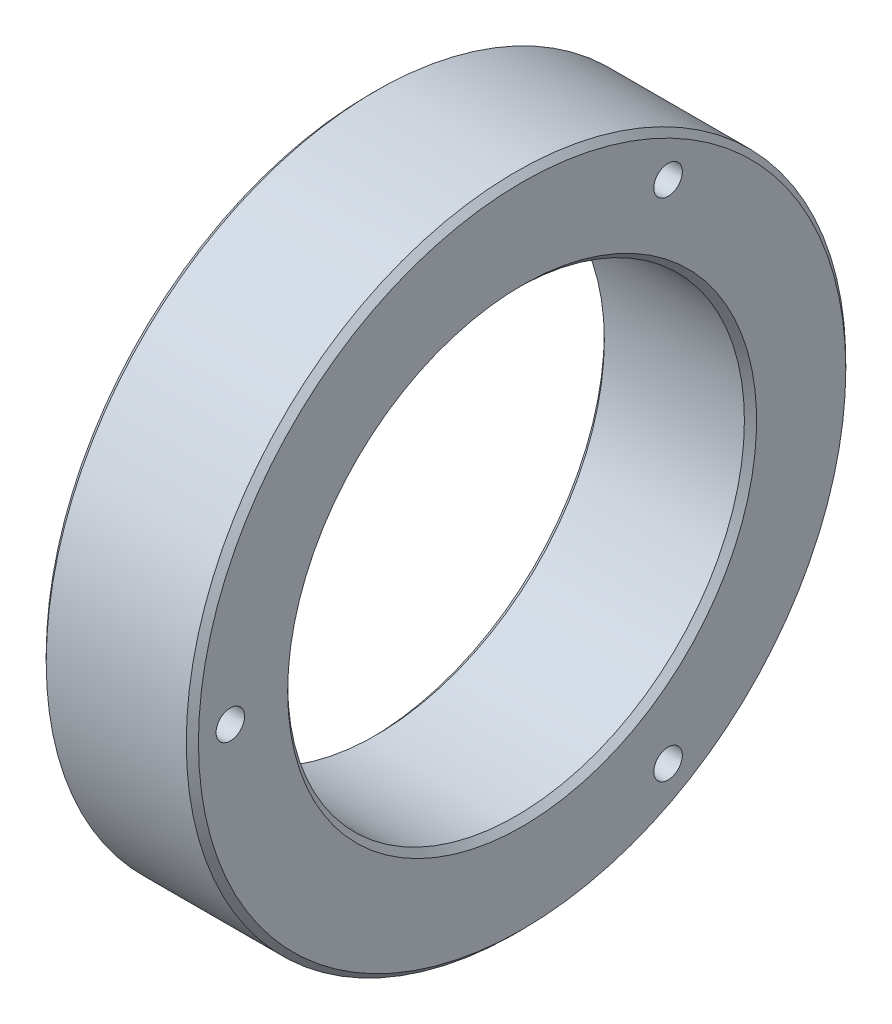
ISO-10303-21;
HEADER;
FILE_DESCRIPTION(('STEP AP214'),'2;1');
FILE_NAME('part.step','',(''),(''),'','','');
FILE_SCHEMA(('AUTOMOTIVE_DESIGN { 1 0 10303 214 1 1 1 1 }'));
ENDSEC;
DATA;
#1=APPLICATION_CONTEXT('core data for automotive mechanical design processes');
#2=APPLICATION_PROTOCOL_DEFINITION('international standard','automotive_design',2000,#1);
#3=PRODUCT_CONTEXT('',#1,'mechanical');
#4=PRODUCT('Part','Part','',(#3));
#5=PRODUCT_RELATED_PRODUCT_CATEGORY('part','',(#4));
#6=PRODUCT_DEFINITION_FORMATION('','',#4);
#7=PRODUCT_DEFINITION_CONTEXT('part definition',#1,'design');
#8=PRODUCT_DEFINITION('design','',#6,#7);
#9=PRODUCT_DEFINITION_SHAPE('','',#8);
#10=(LENGTH_UNIT() NAMED_UNIT(*) SI_UNIT(.MILLI.,.METRE.));
#11=(NAMED_UNIT(*) PLANE_ANGLE_UNIT() SI_UNIT($,.RADIAN.));
#12=(NAMED_UNIT(*) SI_UNIT($,.STERADIAN.) SOLID_ANGLE_UNIT());
#13=UNCERTAINTY_MEASURE_WITH_UNIT(LENGTH_MEASURE(1.E-05),#10,'distance_accuracy_value','');
#14=(GEOMETRIC_REPRESENTATION_CONTEXT(3) GLOBAL_UNCERTAINTY_ASSIGNED_CONTEXT((#13)) GLOBAL_UNIT_ASSIGNED_CONTEXT((#10,
#11,#12)) REPRESENTATION_CONTEXT('',''));
#15=CARTESIAN_POINT('',(0.,0.,0.));
#16=DIRECTION('',(0.,0.,1.));
#17=DIRECTION('',(1.,0.,0.));
#18=AXIS2_PLACEMENT_3D('',#15,#16,#17);
#19=CARTESIAN_POINT('',(0.,57.15,0.));
#20=DIRECTION('',(1.,0.,0.));
#21=DIRECTION('',(0.,0.,-1.));
#22=AXIS2_PLACEMENT_3D('',#19,#20,#21);
#23=PLANE('',#22);
#24=CARTESIAN_POINT('',(0.,0.,0.));
#25=DIRECTION('',(1.,0.,0.));
#26=DIRECTION('',(0.,0.,-1.));
#27=AXIS2_PLACEMENT_3D('',#24,#25,#26);
#28=CIRCLE('',#27,58.674);
#29=CARTESIAN_POINT('',(0.,0.,-58.674));
#30=VERTEX_POINT('',#29);
#31=EDGE_CURVE('E55',#30,#30,#28,.T.);
#32=ORIENTED_EDGE('',*,*,#31,.T.);
#33=EDGE_LOOP('',(#32));
#34=FACE_BOUND('',#33,.T.);
#35=CARTESIAN_POINT('',(0.,0.,0.));
#36=DIRECTION('',(1.,0.,0.));
#37=DIRECTION('',(0.,0.,-1.));
#38=AXIS2_PLACEMENT_3D('',#35,#36,#37);
#39=CIRCLE('',#38,81.0006);
#40=CARTESIAN_POINT('',(0.,0.,-81.0006));
#41=VERTEX_POINT('',#40);
#42=EDGE_CURVE('E59',#41,#41,#39,.F.);
#43=ORIENTED_EDGE('',*,*,#42,.T.);
#44=EDGE_LOOP('',(#43));
#45=FACE_BOUND('',#44,.T.);
#46=CARTESIAN_POINT('',(0.,69.85,0.));
#47=DIRECTION('',(1.,0.,0.));
#48=DIRECTION('',(0.,0.,-1.));
#49=AXIS2_PLACEMENT_3D('',#46,#47,#48);
#50=CIRCLE('',#49,3.96874999999999);
#51=CARTESIAN_POINT('',(0.,69.85,-3.96874999999999));
#52=VERTEX_POINT('',#51);
#53=EDGE_CURVE('E119',#52,#52,#50,.T.);
#54=ORIENTED_EDGE('',*,*,#53,.T.);
#55=EDGE_LOOP('',(#54));
#56=FACE_BOUND('',#55,.T.);
#57=CARTESIAN_POINT('',(0.,-69.85,0.));
#58=DIRECTION('',(1.,0.,0.));
#59=DIRECTION('',(0.,0.,-1.));
#60=AXIS2_PLACEMENT_3D('',#57,#58,#59);
#61=CIRCLE('',#60,3.96874999999999);
#62=CARTESIAN_POINT('',(0.,-69.85,-3.96874999999999));
#63=VERTEX_POINT('',#62);
#64=EDGE_CURVE('E113',#63,#63,#61,.T.);
#65=ORIENTED_EDGE('',*,*,#64,.T.);
#66=EDGE_LOOP('',(#65));
#67=FACE_BOUND('',#66,.T.);
#68=CARTESIAN_POINT('',(0.,63.246,-36.5252));
#69=DIRECTION('',(1.,0.,0.));
#70=DIRECTION('',(0.,0.,-1.));
#71=AXIS2_PLACEMENT_3D('',#68,#69,#70);
#72=CIRCLE('',#71,5.5626);
#73=CARTESIAN_POINT('',(0.,63.246,-42.0878));
#74=VERTEX_POINT('',#73);
#75=EDGE_CURVE('E107',#74,#74,#72,.T.);
#76=ORIENTED_EDGE('',*,*,#75,.T.);
#77=EDGE_LOOP('',(#76));
#78=FACE_BOUND('',#77,.T.);
#79=CARTESIAN_POINT('',(0.,-63.246,-36.5252));
#80=DIRECTION('',(1.,0.,0.));
#81=DIRECTION('',(0.,0.,-1.));
#82=AXIS2_PLACEMENT_3D('',#79,#80,#81);
#83=CIRCLE('',#82,5.5626);
#84=CARTESIAN_POINT('',(0.,-63.246,-42.0878));
#85=VERTEX_POINT('',#84);
#86=EDGE_CURVE('E100',#85,#85,#83,.T.);
#87=ORIENTED_EDGE('',*,*,#86,.T.);
#88=EDGE_LOOP('',(#87));
#89=FACE_BOUND('',#88,.T.);
#90=CARTESIAN_POINT('',(0.,0.,73.025));
#91=DIRECTION('',(1.,0.,0.));
#92=DIRECTION('',(0.,0.,-1.));
#93=AXIS2_PLACEMENT_3D('',#90,#91,#92);
#94=CIRCLE('',#93,5.5626);
#95=CARTESIAN_POINT('',(0.,0.,67.4624));
#96=VERTEX_POINT('',#95);
#97=EDGE_CURVE('E93',#96,#96,#94,.T.);
#98=ORIENTED_EDGE('',*,*,#97,.T.);
#99=EDGE_LOOP('',(#98));
#100=FACE_BOUND('',#99,.T.);
#101=ADVANCED_FACE('F43',(#34,#45,#56,#67,#78,#89,#100),#23,.F.);
#102=CARTESIAN_POINT('',(-25.4,0.,0.));
#103=DIRECTION('',(-1.,0.,0.));
#104=DIRECTION('',(0.,0.,1.));
#105=AXIS2_PLACEMENT_3D('',#102,#103,#104);
#106=CYLINDRICAL_SURFACE('',#105,82.5246);
#107=CARTESIAN_POINT('',(36.576,0.,0.));
#108=DIRECTION('',(-1.,0.,0.));
#109=DIRECTION('',(0.,0.,1.));
#110=AXIS2_PLACEMENT_3D('',#107,#108,#109);
#111=CIRCLE('',#110,82.5246);
#112=CARTESIAN_POINT('',(36.576,0.,82.5246));
#113=VERTEX_POINT('',#112);
#114=EDGE_CURVE('E10',#113,#113,#111,.T.);
#115=ORIENTED_EDGE('',*,*,#114,.T.);
#116=EDGE_LOOP('',(#115));
#117=FACE_BOUND('',#116,.T.);
#118=CARTESIAN_POINT('',(1.524,0.,0.));
#119=DIRECTION('',(1.,0.,0.));
#120=DIRECTION('',(0.,0.,-1.));
#121=AXIS2_PLACEMENT_3D('',#118,#119,#120);
#122=CIRCLE('',#121,82.5246);
#123=CARTESIAN_POINT('',(1.524,0.,-82.5246));
#124=VERTEX_POINT('',#123);
#125=EDGE_CURVE('E51',#124,#124,#122,.T.);
#126=ORIENTED_EDGE('',*,*,#125,.T.);
#127=EDGE_LOOP('',(#126));
#128=FACE_BOUND('',#127,.T.);
#129=ADVANCED_FACE('F142',(#117,#128),#106,.T.);
#130=CARTESIAN_POINT('',(38.1,82.5246,0.));
#131=DIRECTION('',(-1.,0.,0.));
#132=DIRECTION('',(0.,0.,1.));
#133=AXIS2_PLACEMENT_3D('',#130,#131,#132);
#134=PLANE('',#133);
#135=CARTESIAN_POINT('',(38.1,0.,0.));
#136=DIRECTION('',(-1.,0.,0.));
#137=DIRECTION('',(0.,0.,1.));
#138=AXIS2_PLACEMENT_3D('',#135,#136,#137);
#139=CIRCLE('',#138,58.674);
#140=CARTESIAN_POINT('',(38.1,0.,58.674));
#141=VERTEX_POINT('',#140);
#142=EDGE_CURVE('E70',#141,#141,#139,.T.);
#143=ORIENTED_EDGE('',*,*,#142,.T.);
#144=EDGE_LOOP('',(#143));
#145=FACE_BOUND('',#144,.T.);
#146=CARTESIAN_POINT('',(38.1,0.,0.));
#147=DIRECTION('',(-1.,0.,0.));
#148=DIRECTION('',(0.,0.,1.));
#149=AXIS2_PLACEMENT_3D('',#146,#147,#148);
#150=CIRCLE('',#149,81.0006);
#151=CARTESIAN_POINT('',(38.1,0.,81.0006));
#152=VERTEX_POINT('',#151);
#153=EDGE_CURVE('E73',#152,#152,#150,.F.);
#154=ORIENTED_EDGE('',*,*,#153,.T.);
#155=EDGE_LOOP('',(#154));
#156=FACE_BOUND('',#155,.T.);
#157=CARTESIAN_POINT('',(38.1,63.246,-36.5252));
#158=DIRECTION('',(1.,0.,0.));
#159=DIRECTION('',(0.,0.,-1.));
#160=AXIS2_PLACEMENT_3D('',#157,#158,#159);
#161=CIRCLE('',#160,3.5687);
#162=CARTESIAN_POINT('',(38.1,63.246,-32.9565));
#163=VERTEX_POINT('',#162);
#164=EDGE_CURVE('E80',#163,#163,#161,.T.);
#165=ORIENTED_EDGE('',*,*,#164,.F.);
#166=EDGE_LOOP('',(#165));
#167=FACE_BOUND('',#166,.T.);
#168=CARTESIAN_POINT('',(38.1,-63.246,-36.5252));
#169=DIRECTION('',(1.,0.,0.));
#170=DIRECTION('',(0.,0.,-1.));
#171=AXIS2_PLACEMENT_3D('',#168,#169,#170);
#172=CIRCLE('',#171,3.5687);
#173=CARTESIAN_POINT('',(38.1,-63.246,-32.9565));
#174=VERTEX_POINT('',#173);
#175=EDGE_CURVE('E85',#174,#174,#172,.T.);
#176=ORIENTED_EDGE('',*,*,#175,.F.);
#177=EDGE_LOOP('',(#176));
#178=FACE_BOUND('',#177,.T.);
#179=CARTESIAN_POINT('',(38.1,0.,73.025));
#180=DIRECTION('',(1.,0.,0.));
#181=DIRECTION('',(0.,0.,-1.));
#182=AXIS2_PLACEMENT_3D('',#179,#180,#181);
#183=CIRCLE('',#182,3.5687);
#184=CARTESIAN_POINT('',(38.1,0.,76.5937));
#185=VERTEX_POINT('',#184);
#186=EDGE_CURVE('E76',#185,#185,#183,.T.);
#187=ORIENTED_EDGE('',*,*,#186,.F.);
#188=EDGE_LOOP('',(#187));
#189=FACE_BOUND('',#188,.T.);
#190=ADVANCED_FACE('F148',(#145,#156,#167,#178,#189),#134,.F.);
#191=CARTESIAN_POINT('',(-25.4,0.,0.));
#192=DIRECTION('',(-1.,0.,0.));
#193=DIRECTION('',(0.,0.,1.));
#194=AXIS2_PLACEMENT_3D('',#191,#192,#193);
#195=CYLINDRICAL_SURFACE('',#194,57.15);
#196=CARTESIAN_POINT('',(36.576,0.,0.));
#197=DIRECTION('',(-1.,0.,0.));
#198=DIRECTION('',(0.,0.,1.));
#199=AXIS2_PLACEMENT_3D('',#196,#197,#198);
#200=CIRCLE('',#199,57.15);
#201=CARTESIAN_POINT('',(36.576,0.,57.15));
#202=VERTEX_POINT('',#201);
#203=EDGE_CURVE('E64',#202,#202,#200,.F.);
#204=ORIENTED_EDGE('',*,*,#203,.T.);
#205=EDGE_LOOP('',(#204));
#206=FACE_BOUND('',#205,.T.);
#207=CARTESIAN_POINT('',(1.52399999999998,0.,0.));
#208=DIRECTION('',(1.,0.,0.));
#209=DIRECTION('',(0.,0.,-1.));
#210=AXIS2_PLACEMENT_3D('',#207,#208,#209);
#211=CIRCLE('',#210,57.15);
#212=CARTESIAN_POINT('',(1.52399999999998,0.,-57.15));
#213=VERTEX_POINT('',#212);
#214=EDGE_CURVE('E67',#213,#213,#211,.F.);
#215=ORIENTED_EDGE('',*,*,#214,.T.);
#216=EDGE_LOOP('',(#215));
#217=FACE_BOUND('',#216,.T.);
#218=ADVANCED_FACE('F176',(#206,#217),#195,.F.);
#219=CARTESIAN_POINT('',(38.1,0.,73.025));
#220=DIRECTION('',(-1.,0.,0.));
#221=DIRECTION('',(0.,0.,1.));
#222=AXIS2_PLACEMENT_3D('',#219,#220,#221);
#223=CYLINDRICAL_SURFACE('',#222,3.5687);
#224=CARTESIAN_POINT('',(9.652,0.,73.025));
#225=DIRECTION('',(1.,0.,0.));
#226=DIRECTION('',(0.,0.,-1.));
#227=AXIS2_PLACEMENT_3D('',#224,#225,#226);
#228=CIRCLE('',#227,3.5687);
#229=CARTESIAN_POINT('',(9.652,0.,76.5937));
#230=VERTEX_POINT('',#229);
#231=EDGE_CURVE('E87',#230,#230,#228,.T.);
#232=CARTESIAN_POINT('',(9.652,0.,76.5937));
#233=CARTESIAN_POINT('',(9.94833333333333,0.,76.5937));
#234=CARTESIAN_POINT('',(10.2446666666667,0.,76.5937));
#235=CARTESIAN_POINT('',(10.8373333333333,0.,76.5937));
#236=CARTESIAN_POINT('',(11.1336666666667,0.,76.5937));
#237=CARTESIAN_POINT('',(11.7263333333333,0.,76.5937));
#238=CARTESIAN_POINT('',(12.0226666666667,0.,76.5937));
#239=CARTESIAN_POINT('',(12.6153333333333,0.,76.5937));
#240=CARTESIAN_POINT('',(12.9116666666667,0.,76.5937));
#241=CARTESIAN_POINT('',(13.5043333333333,0.,76.5937));
#242=CARTESIAN_POINT('',(13.8006666666667,0.,76.5937));
#243=CARTESIAN_POINT('',(14.3933333333333,0.,76.5937));
#244=CARTESIAN_POINT('',(14.6896666666667,0.,76.5937));
#245=CARTESIAN_POINT('',(15.2823333333333,0.,76.5937));
#246=CARTESIAN_POINT('',(15.5786666666667,0.,76.5937));
#247=CARTESIAN_POINT('',(16.1713333333333,0.,76.5937));
#248=CARTESIAN_POINT('',(16.4676666666667,0.,76.5937));
#249=CARTESIAN_POINT('',(17.0603333333333,0.,76.5937));
#250=CARTESIAN_POINT('',(17.3566666666667,0.,76.5937));
#251=CARTESIAN_POINT('',(17.9493333333333,0.,76.5937));
#252=CARTESIAN_POINT('',(18.2456666666667,0.,76.5937));
#253=CARTESIAN_POINT('',(18.8383333333333,0.,76.5937));
#254=CARTESIAN_POINT('',(19.1346666666667,0.,76.5937));
#255=CARTESIAN_POINT('',(19.7273333333333,0.,76.5937));
#256=CARTESIAN_POINT('',(20.0236666666667,0.,76.5937));
#257=CARTESIAN_POINT('',(20.6163333333333,0.,76.5937));
#258=CARTESIAN_POINT('',(20.9126666666667,0.,76.5937));
#259=CARTESIAN_POINT('',(21.5053333333333,0.,76.5937));
#260=CARTESIAN_POINT('',(21.8016666666667,0.,76.5937));
#261=CARTESIAN_POINT('',(22.3943333333333,0.,76.5937));
#262=CARTESIAN_POINT('',(22.6906666666667,0.,76.5937));
#263=CARTESIAN_POINT('',(23.2833333333333,0.,76.5937));
#264=CARTESIAN_POINT('',(23.5796666666667,0.,76.5937));
#265=CARTESIAN_POINT('',(24.1723333333333,0.,76.5937));
#266=CARTESIAN_POINT('',(24.4686666666667,0.,76.5937));
#267=CARTESIAN_POINT('',(25.0613333333333,0.,76.5937));
#268=CARTESIAN_POINT('',(25.3576666666667,0.,76.5937));
#269=CARTESIAN_POINT('',(25.9503333333333,0.,76.5937));
#270=CARTESIAN_POINT('',(26.2466666666667,0.,76.5937));
#271=CARTESIAN_POINT('',(26.8393333333333,0.,76.5937));
#272=CARTESIAN_POINT('',(27.1356666666667,0.,76.5937));
#273=CARTESIAN_POINT('',(27.7283333333333,0.,76.5937));
#274=CARTESIAN_POINT('',(28.0246666666667,0.,76.5937));
#275=CARTESIAN_POINT('',(28.6173333333333,0.,76.5937));
#276=CARTESIAN_POINT('',(28.9136666666667,0.,76.5937));
#277=CARTESIAN_POINT('',(29.5063333333333,0.,76.5937));
#278=CARTESIAN_POINT('',(29.8026666666667,0.,76.5937));
#279=CARTESIAN_POINT('',(30.3953333333333,0.,76.5937));
#280=CARTESIAN_POINT('',(30.6916666666667,0.,76.5937));
#281=CARTESIAN_POINT('',(31.2843333333333,0.,76.5937));
#282=CARTESIAN_POINT('',(31.5806666666667,0.,76.5937));
#283=CARTESIAN_POINT('',(32.1733333333333,0.,76.5937));
#284=CARTESIAN_POINT('',(32.4696666666667,0.,76.5937));
#285=CARTESIAN_POINT('',(33.0623333333333,0.,76.5937));
#286=CARTESIAN_POINT('',(33.3586666666667,0.,76.5937));
#287=CARTESIAN_POINT('',(33.9513333333333,0.,76.5937));
#288=CARTESIAN_POINT('',(34.2476666666667,0.,76.5937));
#289=CARTESIAN_POINT('',(34.8403333333333,0.,76.5937));
#290=CARTESIAN_POINT('',(35.1366666666667,0.,76.5937));
#291=CARTESIAN_POINT('',(35.7293333333333,0.,76.5937));
#292=CARTESIAN_POINT('',(36.0256666666667,0.,76.5937));
#293=CARTESIAN_POINT('',(36.6183333333333,0.,76.5937));
#294=CARTESIAN_POINT('',(36.9146666666667,0.,76.5937));
#295=CARTESIAN_POINT('',(37.5073333333333,0.,76.5937));
#296=CARTESIAN_POINT('',(37.8036666666667,0.,76.5937));
#297=CARTESIAN_POINT('',(38.1,0.,76.5937));
#298=B_SPLINE_CURVE_WITH_KNOTS('',3,(#232,#233,#234,#235,#236,#237,#238,#239,#240,#241,#242,
#243,#244,#245,#246,#247,#248,#249,#250,#251,#252,#253,#254,#255,#256,#257,#258,#259,#260,#261,
#262,#263,#264,#265,#266,#267,#268,#269,#270,#271,#272,#273,#274,#275,#276,#277,#278,#279,#280,
#281,#282,#283,#284,#285,#286,#287,#288,#289,#290,#291,#292,#293,#294,#295,#296,#297),
.UNSPECIFIED.,.F.,.F.,(4,2,2,2,2,2,2,2,2,2,2,2,2,2,2,2,2,2,2,2,2,2,2,2,2,2,2,2,2,2,2,2,4),(0.,
0.889000000000001,1.778,2.667,3.556,4.445,5.334,6.223,7.112,8.001,8.89,9.779,10.668,11.557,
12.446,13.335,14.224,15.113,16.002,16.891,17.78,18.669,19.558,20.447,21.336,22.225,23.114,
24.003,24.892,25.781,26.67,27.559,28.448),.UNSPECIFIED.);
#299=EDGE_CURVE('BSEAM184',#230,#185,#298,.T.);
#300=ORIENTED_EDGE('',*,*,#231,.F.);
#301=ORIENTED_EDGE('',*,*,#186,.T.);
#302=ORIENTED_EDGE('',*,*,#299,.T.);
#303=ORIENTED_EDGE('',*,*,#299,.F.);
#304=EDGE_LOOP('',(#300,#302,#301,#303));
#305=FACE_BOUND('',#304,.T.);
#306=ADVANCED_FACE('F184',(#305),#223,.F.);
#307=CARTESIAN_POINT('',(9.652,0.,73.025));
#308=DIRECTION('',(-1.,0.,0.));
#309=DIRECTION('',(0.,0.,1.));
#310=AXIS2_PLACEMENT_3D('',#307,#308,#309);
#311=CYLINDRICAL_SURFACE('',#310,5.5626);
#312=CARTESIAN_POINT('',(9.652,0.,73.025));
#313=DIRECTION('',(1.,0.,0.));
#314=DIRECTION('',(0.,0.,-1.));
#315=AXIS2_PLACEMENT_3D('',#312,#313,#314);
#316=CIRCLE('',#315,5.5626);
#317=CARTESIAN_POINT('',(9.652,0.,67.4624));
#318=VERTEX_POINT('',#317);
#319=EDGE_CURVE('E90',#318,#318,#316,.T.);
#320=ORIENTED_EDGE('',*,*,#319,.T.);
#321=EDGE_LOOP('',(#320));
#322=FACE_BOUND('',#321,.T.);
#323=ORIENTED_EDGE('',*,*,#97,.F.);
#324=EDGE_LOOP('',(#323));
#325=FACE_BOUND('',#324,.T.);
#326=ADVANCED_FACE('F186',(#322,#325),#311,.F.);
#327=CARTESIAN_POINT('',(9.652,0.,73.025));
#328=DIRECTION('',(1.,0.,0.));
#329=DIRECTION('',(0.,0.,-1.));
#330=AXIS2_PLACEMENT_3D('',#327,#328,#329);
#331=PLANE('',#330);
#332=ORIENTED_EDGE('',*,*,#231,.T.);
#333=EDGE_LOOP('',(#332));
#334=FACE_BOUND('',#333,.T.);
#335=ORIENTED_EDGE('',*,*,#319,.F.);
#336=EDGE_LOOP('',(#335));
#337=FACE_BOUND('',#336,.T.);
#338=ADVANCED_FACE('F192',(#334,#337),#331,.F.);
#339=CARTESIAN_POINT('',(38.1,-63.246,-36.5252));
#340=DIRECTION('',(-1.,0.,0.));
#341=DIRECTION('',(0.,0.,1.));
#342=AXIS2_PLACEMENT_3D('',#339,#340,#341);
#343=CYLINDRICAL_SURFACE('',#342,3.5687);
#344=CARTESIAN_POINT('',(9.652,-63.246,-36.5252));
#345=DIRECTION('',(1.,0.,0.));
#346=DIRECTION('',(0.,0.,-1.));
#347=AXIS2_PLACEMENT_3D('',#344,#345,#346);
#348=CIRCLE('',#347,3.5687);
#349=CARTESIAN_POINT('',(9.652,-63.246,-32.9565));
#350=VERTEX_POINT('',#349);
#351=EDGE_CURVE('E82',#350,#350,#348,.T.);
#352=CARTESIAN_POINT('',(9.652,-63.246,-32.9565));
#353=CARTESIAN_POINT('',(9.94833333333333,-63.246,-32.9565));
#354=CARTESIAN_POINT('',(10.2446666666667,-63.246,-32.9565));
#355=CARTESIAN_POINT('',(10.8373333333333,-63.246,-32.9565));
#356=CARTESIAN_POINT('',(11.1336666666667,-63.246,-32.9565));
#357=CARTESIAN_POINT('',(11.7263333333333,-63.246,-32.9565));
#358=CARTESIAN_POINT('',(12.0226666666667,-63.246,-32.9565));
#359=CARTESIAN_POINT('',(12.6153333333333,-63.246,-32.9565));
#360=CARTESIAN_POINT('',(12.9116666666667,-63.246,-32.9565));
#361=CARTESIAN_POINT('',(13.5043333333333,-63.246,-32.9565));
#362=CARTESIAN_POINT('',(13.8006666666667,-63.246,-32.9565));
#363=CARTESIAN_POINT('',(14.3933333333333,-63.246,-32.9565));
#364=CARTESIAN_POINT('',(14.6896666666667,-63.246,-32.9565));
#365=CARTESIAN_POINT('',(15.2823333333333,-63.246,-32.9565));
#366=CARTESIAN_POINT('',(15.5786666666667,-63.246,-32.9565));
#367=CARTESIAN_POINT('',(16.1713333333333,-63.246,-32.9565));
#368=CARTESIAN_POINT('',(16.4676666666667,-63.246,-32.9565));
#369=CARTESIAN_POINT('',(17.0603333333333,-63.246,-32.9565));
#370=CARTESIAN_POINT('',(17.3566666666667,-63.246,-32.9565));
#371=CARTESIAN_POINT('',(17.9493333333333,-63.246,-32.9565));
#372=CARTESIAN_POINT('',(18.2456666666667,-63.246,-32.9565));
#373=CARTESIAN_POINT('',(18.8383333333333,-63.246,-32.9565));
#374=CARTESIAN_POINT('',(19.1346666666667,-63.246,-32.9565));
#375=CARTESIAN_POINT('',(19.7273333333333,-63.246,-32.9565));
#376=CARTESIAN_POINT('',(20.0236666666667,-63.246,-32.9565));
#377=CARTESIAN_POINT('',(20.6163333333333,-63.246,-32.9565));
#378=CARTESIAN_POINT('',(20.9126666666667,-63.246,-32.9565));
#379=CARTESIAN_POINT('',(21.5053333333333,-63.246,-32.9565));
#380=CARTESIAN_POINT('',(21.8016666666667,-63.246,-32.9565));
#381=CARTESIAN_POINT('',(22.3943333333333,-63.246,-32.9565));
#382=CARTESIAN_POINT('',(22.6906666666667,-63.246,-32.9565));
#383=CARTESIAN_POINT('',(23.2833333333333,-63.246,-32.9565));
#384=CARTESIAN_POINT('',(23.5796666666667,-63.246,-32.9565));
#385=CARTESIAN_POINT('',(24.1723333333333,-63.246,-32.9565));
#386=CARTESIAN_POINT('',(24.4686666666667,-63.246,-32.9565));
#387=CARTESIAN_POINT('',(25.0613333333333,-63.246,-32.9565));
#388=CARTESIAN_POINT('',(25.3576666666667,-63.246,-32.9565));
#389=CARTESIAN_POINT('',(25.9503333333333,-63.246,-32.9565));
#390=CARTESIAN_POINT('',(26.2466666666667,-63.246,-32.9565));
#391=CARTESIAN_POINT('',(26.8393333333333,-63.246,-32.9565));
#392=CARTESIAN_POINT('',(27.1356666666667,-63.246,-32.9565));
#393=CARTESIAN_POINT('',(27.7283333333333,-63.246,-32.9565));
#394=CARTESIAN_POINT('',(28.0246666666667,-63.246,-32.9565));
#395=CARTESIAN_POINT('',(28.6173333333333,-63.246,-32.9565));
#396=CARTESIAN_POINT('',(28.9136666666667,-63.246,-32.9565));
#397=CARTESIAN_POINT('',(29.5063333333333,-63.246,-32.9565));
#398=CARTESIAN_POINT('',(29.8026666666667,-63.246,-32.9565));
#399=CARTESIAN_POINT('',(30.3953333333333,-63.246,-32.9565));
#400=CARTESIAN_POINT('',(30.6916666666667,-63.246,-32.9565));
#401=CARTESIAN_POINT('',(31.2843333333333,-63.246,-32.9565));
#402=CARTESIAN_POINT('',(31.5806666666667,-63.246,-32.9565));
#403=CARTESIAN_POINT('',(32.1733333333333,-63.246,-32.9565));
#404=CARTESIAN_POINT('',(32.4696666666667,-63.246,-32.9565));
#405=CARTESIAN_POINT('',(33.0623333333333,-63.246,-32.9565));
#406=CARTESIAN_POINT('',(33.3586666666667,-63.246,-32.9565));
#407=CARTESIAN_POINT('',(33.9513333333333,-63.246,-32.9565));
#408=CARTESIAN_POINT('',(34.2476666666667,-63.246,-32.9565));
#409=CARTESIAN_POINT('',(34.8403333333333,-63.246,-32.9565));
#410=CARTESIAN_POINT('',(35.1366666666667,-63.246,-32.9565));
#411=CARTESIAN_POINT('',(35.7293333333333,-63.246,-32.9565));
#412=CARTESIAN_POINT('',(36.0256666666667,-63.246,-32.9565));
#413=CARTESIAN_POINT('',(36.6183333333333,-63.246,-32.9565));
#414=CARTESIAN_POINT('',(36.9146666666667,-63.246,-32.9565));
#415=CARTESIAN_POINT('',(37.5073333333333,-63.246,-32.9565));
#416=CARTESIAN_POINT('',(37.8036666666667,-63.246,-32.9565));
#417=CARTESIAN_POINT('',(38.1,-63.246,-32.9565));
#418=B_SPLINE_CURVE_WITH_KNOTS('',3,(#352,#353,#354,#355,#356,#357,#358,#359,#360,#361,#362,
#363,#364,#365,#366,#367,#368,#369,#370,#371,#372,#373,#374,#375,#376,#377,#378,#379,#380,#381,
#382,#383,#384,#385,#386,#387,#388,#389,#390,#391,#392,#393,#394,#395,#396,#397,#398,#399,#400,
#401,#402,#403,#404,#405,#406,#407,#408,#409,#410,#411,#412,#413,#414,#415,#416,#417),
.UNSPECIFIED.,.F.,.F.,(4,2,2,2,2,2,2,2,2,2,2,2,2,2,2,2,2,2,2,2,2,2,2,2,2,2,2,2,2,2,2,2,4),(0.,
0.889000000000001,1.778,2.667,3.556,4.445,5.334,6.223,7.112,8.001,8.89,9.779,10.668,11.557,
12.446,13.335,14.224,15.113,16.002,16.891,17.78,18.669,19.558,20.447,21.336,22.225,23.114,
24.003,24.892,25.781,26.67,27.559,28.448),.UNSPECIFIED.);
#419=EDGE_CURVE('BSEAM202',#350,#174,#418,.T.);
#420=ORIENTED_EDGE('',*,*,#351,.F.);
#421=ORIENTED_EDGE('',*,*,#175,.T.);
#422=ORIENTED_EDGE('',*,*,#419,.T.);
#423=ORIENTED_EDGE('',*,*,#419,.F.);
#424=EDGE_LOOP('',(#420,#422,#421,#423));
#425=FACE_BOUND('',#424,.T.);
#426=ADVANCED_FACE('F202',(#425),#343,.F.);
#427=CARTESIAN_POINT('',(9.652,-63.246,-36.5252));
#428=DIRECTION('',(-1.,0.,0.));
#429=DIRECTION('',(0.,0.,1.));
#430=AXIS2_PLACEMENT_3D('',#427,#428,#429);
#431=CYLINDRICAL_SURFACE('',#430,5.5626);
#432=CARTESIAN_POINT('',(9.652,-63.246,-36.5252));
#433=DIRECTION('',(1.,0.,0.));
#434=DIRECTION('',(0.,0.,-1.));
#435=AXIS2_PLACEMENT_3D('',#432,#433,#434);
#436=CIRCLE('',#435,5.5626);
#437=CARTESIAN_POINT('',(9.652,-63.246,-42.0878));
#438=VERTEX_POINT('',#437);
#439=EDGE_CURVE('E86',#438,#438,#436,.T.);
#440=ORIENTED_EDGE('',*,*,#439,.T.);
#441=EDGE_LOOP('',(#440));
#442=FACE_BOUND('',#441,.T.);
#443=ORIENTED_EDGE('',*,*,#86,.F.);
#444=EDGE_LOOP('',(#443));
#445=FACE_BOUND('',#444,.T.);
#446=ADVANCED_FACE('F206',(#442,#445),#431,.F.);
#447=CARTESIAN_POINT('',(9.652,-63.246,-36.5252));
#448=DIRECTION('',(1.,0.,0.));
#449=DIRECTION('',(0.,0.,-1.));
#450=AXIS2_PLACEMENT_3D('',#447,#448,#449);
#451=PLANE('',#450);
#452=ORIENTED_EDGE('',*,*,#351,.T.);
#453=EDGE_LOOP('',(#452));
#454=FACE_BOUND('',#453,.T.);
#455=ORIENTED_EDGE('',*,*,#439,.F.);
#456=EDGE_LOOP('',(#455));
#457=FACE_BOUND('',#456,.T.);
#458=ADVANCED_FACE('F210',(#454,#457),#451,.F.);
#459=CARTESIAN_POINT('',(38.1,63.246,-36.5252));
#460=DIRECTION('',(-1.,0.,0.));
#461=DIRECTION('',(0.,0.,1.));
#462=AXIS2_PLACEMENT_3D('',#459,#460,#461);
#463=CYLINDRICAL_SURFACE('',#462,3.5687);
#464=CARTESIAN_POINT('',(9.652,63.246,-36.5252));
#465=DIRECTION('',(1.,0.,0.));
#466=DIRECTION('',(0.,0.,-1.));
#467=AXIS2_PLACEMENT_3D('',#464,#465,#466);
#468=CIRCLE('',#467,3.5687);
#469=CARTESIAN_POINT('',(9.652,63.246,-32.9565));
#470=VERTEX_POINT('',#469);
#471=EDGE_CURVE('E77',#470,#470,#468,.T.);
#472=CARTESIAN_POINT('',(9.652,63.246,-32.9565));
#473=CARTESIAN_POINT('',(9.94833333333333,63.246,-32.9565));
#474=CARTESIAN_POINT('',(10.2446666666667,63.246,-32.9565));
#475=CARTESIAN_POINT('',(10.8373333333333,63.246,-32.9565));
#476=CARTESIAN_POINT('',(11.1336666666667,63.246,-32.9565));
#477=CARTESIAN_POINT('',(11.7263333333333,63.246,-32.9565));
#478=CARTESIAN_POINT('',(12.0226666666667,63.246,-32.9565));
#479=CARTESIAN_POINT('',(12.6153333333333,63.246,-32.9565));
#480=CARTESIAN_POINT('',(12.9116666666667,63.246,-32.9565));
#481=CARTESIAN_POINT('',(13.5043333333333,63.246,-32.9565));
#482=CARTESIAN_POINT('',(13.8006666666667,63.246,-32.9565));
#483=CARTESIAN_POINT('',(14.3933333333333,63.246,-32.9565));
#484=CARTESIAN_POINT('',(14.6896666666667,63.246,-32.9565));
#485=CARTESIAN_POINT('',(15.2823333333333,63.246,-32.9565));
#486=CARTESIAN_POINT('',(15.5786666666667,63.246,-32.9565));
#487=CARTESIAN_POINT('',(16.1713333333333,63.246,-32.9565));
#488=CARTESIAN_POINT('',(16.4676666666667,63.246,-32.9565));
#489=CARTESIAN_POINT('',(17.0603333333333,63.246,-32.9565));
#490=CARTESIAN_POINT('',(17.3566666666667,63.246,-32.9565));
#491=CARTESIAN_POINT('',(17.9493333333333,63.246,-32.9565));
#492=CARTESIAN_POINT('',(18.2456666666667,63.246,-32.9565));
#493=CARTESIAN_POINT('',(18.8383333333333,63.246,-32.9565));
#494=CARTESIAN_POINT('',(19.1346666666667,63.246,-32.9565));
#495=CARTESIAN_POINT('',(19.7273333333333,63.246,-32.9565));
#496=CARTESIAN_POINT('',(20.0236666666667,63.246,-32.9565));
#497=CARTESIAN_POINT('',(20.6163333333333,63.246,-32.9565));
#498=CARTESIAN_POINT('',(20.9126666666667,63.246,-32.9565));
#499=CARTESIAN_POINT('',(21.5053333333333,63.246,-32.9565));
#500=CARTESIAN_POINT('',(21.8016666666667,63.246,-32.9565));
#501=CARTESIAN_POINT('',(22.3943333333333,63.246,-32.9565));
#502=CARTESIAN_POINT('',(22.6906666666667,63.246,-32.9565));
#503=CARTESIAN_POINT('',(23.2833333333333,63.246,-32.9565));
#504=CARTESIAN_POINT('',(23.5796666666667,63.246,-32.9565));
#505=CARTESIAN_POINT('',(24.1723333333333,63.246,-32.9565));
#506=CARTESIAN_POINT('',(24.4686666666667,63.246,-32.9565));
#507=CARTESIAN_POINT('',(25.0613333333333,63.246,-32.9565));
#508=CARTESIAN_POINT('',(25.3576666666667,63.246,-32.9565));
#509=CARTESIAN_POINT('',(25.9503333333333,63.246,-32.9565));
#510=CARTESIAN_POINT('',(26.2466666666667,63.246,-32.9565));
#511=CARTESIAN_POINT('',(26.8393333333333,63.246,-32.9565));
#512=CARTESIAN_POINT('',(27.1356666666667,63.246,-32.9565));
#513=CARTESIAN_POINT('',(27.7283333333333,63.246,-32.9565));
#514=CARTESIAN_POINT('',(28.0246666666667,63.246,-32.9565));
#515=CARTESIAN_POINT('',(28.6173333333333,63.246,-32.9565));
#516=CARTESIAN_POINT('',(28.9136666666667,63.246,-32.9565));
#517=CARTESIAN_POINT('',(29.5063333333333,63.246,-32.9565));
#518=CARTESIAN_POINT('',(29.8026666666667,63.246,-32.9565));
#519=CARTESIAN_POINT('',(30.3953333333333,63.246,-32.9565));
#520=CARTESIAN_POINT('',(30.6916666666667,63.246,-32.9565));
#521=CARTESIAN_POINT('',(31.2843333333333,63.246,-32.9565));
#522=CARTESIAN_POINT('',(31.5806666666667,63.246,-32.9565));
#523=CARTESIAN_POINT('',(32.1733333333333,63.246,-32.9565));
#524=CARTESIAN_POINT('',(32.4696666666667,63.246,-32.9565));
#525=CARTESIAN_POINT('',(33.0623333333333,63.246,-32.9565));
#526=CARTESIAN_POINT('',(33.3586666666667,63.246,-32.9565));
#527=CARTESIAN_POINT('',(33.9513333333333,63.246,-32.9565));
#528=CARTESIAN_POINT('',(34.2476666666667,63.246,-32.9565));
#529=CARTESIAN_POINT('',(34.8403333333333,63.246,-32.9565));
#530=CARTESIAN_POINT('',(35.1366666666667,63.246,-32.9565));
#531=CARTESIAN_POINT('',(35.7293333333333,63.246,-32.9565));
#532=CARTESIAN_POINT('',(36.0256666666667,63.246,-32.9565));
#533=CARTESIAN_POINT('',(36.6183333333333,63.246,-32.9565));
#534=CARTESIAN_POINT('',(36.9146666666667,63.246,-32.9565));
#535=CARTESIAN_POINT('',(37.5073333333333,63.246,-32.9565));
#536=CARTESIAN_POINT('',(37.8036666666667,63.246,-32.9565));
#537=CARTESIAN_POINT('',(38.1,63.246,-32.9565));
#538=B_SPLINE_CURVE_WITH_KNOTS('',3,(#472,#473,#474,#475,#476,#477,#478,#479,#480,#481,#482,
#483,#484,#485,#486,#487,#488,#489,#490,#491,#492,#493,#494,#495,#496,#497,#498,#499,#500,#501,
#502,#503,#504,#505,#506,#507,#508,#509,#510,#511,#512,#513,#514,#515,#516,#517,#518,#519,#520,
#521,#522,#523,#524,#525,#526,#527,#528,#529,#530,#531,#532,#533,#534,#535,#536,#537),
.UNSPECIFIED.,.F.,.F.,(4,2,2,2,2,2,2,2,2,2,2,2,2,2,2,2,2,2,2,2,2,2,2,2,2,2,2,2,2,2,2,2,4),(0.,
0.889000000000001,1.778,2.667,3.556,4.445,5.334,6.223,7.112,8.001,8.89,9.779,10.668,11.557,
12.446,13.335,14.224,15.113,16.002,16.891,17.78,18.669,19.558,20.447,21.336,22.225,23.114,
24.003,24.892,25.781,26.67,27.559,28.448),.UNSPECIFIED.);
#539=EDGE_CURVE('BSEAM214',#470,#163,#538,.T.);
#540=ORIENTED_EDGE('',*,*,#471,.F.);
#541=ORIENTED_EDGE('',*,*,#164,.T.);
#542=ORIENTED_EDGE('',*,*,#539,.T.);
#543=ORIENTED_EDGE('',*,*,#539,.F.);
#544=EDGE_LOOP('',(#540,#542,#541,#543));
#545=FACE_BOUND('',#544,.T.);
#546=ADVANCED_FACE('F214',(#545),#463,.F.);
#547=CARTESIAN_POINT('',(9.652,63.246,-36.5252));
#548=DIRECTION('',(-1.,0.,0.));
#549=DIRECTION('',(0.,0.,1.));
#550=AXIS2_PLACEMENT_3D('',#547,#548,#549);
#551=CYLINDRICAL_SURFACE('',#550,5.5626);
#552=CARTESIAN_POINT('',(9.652,63.246,-36.5252));
#553=DIRECTION('',(1.,0.,0.));
#554=DIRECTION('',(0.,0.,-1.));
#555=AXIS2_PLACEMENT_3D('',#552,#553,#554);
#556=CIRCLE('',#555,5.5626);
#557=CARTESIAN_POINT('',(9.652,63.246,-42.0878));
#558=VERTEX_POINT('',#557);
#559=EDGE_CURVE('E81',#558,#558,#556,.T.);
#560=ORIENTED_EDGE('',*,*,#559,.T.);
#561=EDGE_LOOP('',(#560));
#562=FACE_BOUND('',#561,.T.);
#563=ORIENTED_EDGE('',*,*,#75,.F.);
#564=EDGE_LOOP('',(#563));
#565=FACE_BOUND('',#564,.T.);
#566=ADVANCED_FACE('F218',(#562,#565),#551,.F.);
#567=CARTESIAN_POINT('',(9.652,63.246,-36.5252));
#568=DIRECTION('',(1.,0.,0.));
#569=DIRECTION('',(0.,0.,-1.));
#570=AXIS2_PLACEMENT_3D('',#567,#568,#569);
#571=PLANE('',#570);
#572=ORIENTED_EDGE('',*,*,#471,.T.);
#573=EDGE_LOOP('',(#572));
#574=FACE_BOUND('',#573,.T.);
#575=ORIENTED_EDGE('',*,*,#559,.F.);
#576=EDGE_LOOP('',(#575));
#577=FACE_BOUND('',#576,.T.);
#578=ADVANCED_FACE('F222',(#574,#577),#571,.F.);
#579=CARTESIAN_POINT('',(25.4,-69.85,0.));
#580=DIRECTION('',(-1.,0.,0.));
#581=DIRECTION('',(0.,0.,1.));
#582=AXIS2_PLACEMENT_3D('',#579,#580,#581);
#583=CYLINDRICAL_SURFACE('',#582,3.96874999999999);
#584=CARTESIAN_POINT('',(25.4,-69.85,0.));
#585=DIRECTION('',(1.,0.,0.));
#586=DIRECTION('',(0.,0.,-1.));
#587=AXIS2_PLACEMENT_3D('',#584,#585,#586);
#588=CIRCLE('',#587,3.96874999999999);
#589=CARTESIAN_POINT('',(25.4,-69.85,-3.96874999999999));
#590=VERTEX_POINT('',#589);
#591=EDGE_CURVE('E110',#590,#590,#588,.T.);
#592=ORIENTED_EDGE('',*,*,#591,.T.);
#593=EDGE_LOOP('',(#592));
#594=FACE_BOUND('',#593,.T.);
#595=ORIENTED_EDGE('',*,*,#64,.F.);
#596=EDGE_LOOP('',(#595));
#597=FACE_BOUND('',#596,.T.);
#598=ADVANCED_FACE('F226',(#594,#597),#583,.F.);
#599=CARTESIAN_POINT('',(25.4,-69.85,0.));
#600=DIRECTION('',(1.,0.,0.));
#601=DIRECTION('',(0.,0.,-1.));
#602=AXIS2_PLACEMENT_3D('',#599,#600,#601);
#603=PLANE('',#602);
#604=ORIENTED_EDGE('',*,*,#591,.F.);
#605=EDGE_LOOP('',(#604));
#606=FACE_BOUND('',#605,.T.);
#607=ADVANCED_FACE('F140',(#606),#603,.F.);
#608=CARTESIAN_POINT('',(25.4,69.85,0.));
#609=DIRECTION('',(-1.,0.,0.));
#610=DIRECTION('',(0.,0.,1.));
#611=AXIS2_PLACEMENT_3D('',#608,#609,#610);
#612=CYLINDRICAL_SURFACE('',#611,3.96874999999999);
#613=CARTESIAN_POINT('',(25.4,69.85,0.));
#614=DIRECTION('',(1.,0.,0.));
#615=DIRECTION('',(0.,0.,-1.));
#616=AXIS2_PLACEMENT_3D('',#613,#614,#615);
#617=CIRCLE('',#616,3.96874999999999);
#618=CARTESIAN_POINT('',(25.4,69.85,-3.96874999999999));
#619=VERTEX_POINT('',#618);
#620=EDGE_CURVE('E116',#619,#619,#617,.T.);
#621=ORIENTED_EDGE('',*,*,#620,.T.);
#622=EDGE_LOOP('',(#621));
#623=FACE_BOUND('',#622,.T.);
#624=ORIENTED_EDGE('',*,*,#53,.F.);
#625=EDGE_LOOP('',(#624));
#626=FACE_BOUND('',#625,.T.);
#627=ADVANCED_FACE('F125',(#623,#626),#612,.F.);
#628=CARTESIAN_POINT('',(25.4,69.85,0.));
#629=DIRECTION('',(1.,0.,0.));
#630=DIRECTION('',(0.,0.,-1.));
#631=AXIS2_PLACEMENT_3D('',#628,#629,#630);
#632=PLANE('',#631);
#633=ORIENTED_EDGE('',*,*,#620,.F.);
#634=EDGE_LOOP('',(#633));
#635=FACE_BOUND('',#634,.T.);
#636=ADVANCED_FACE('F128',(#635),#632,.F.);
#637=CARTESIAN_POINT('',(38.1,0.,0.));
#638=DIRECTION('',(1.,0.,0.));
#639=DIRECTION('',(0.,0.,-1.));
#640=AXIS2_PLACEMENT_3D('',#637,#638,#639);
#641=CONICAL_SURFACE('',#640,58.674,0.785398163397444);
#642=ORIENTED_EDGE('',*,*,#203,.F.);
#643=EDGE_LOOP('',(#642));
#644=FACE_BOUND('',#643,.T.);
#645=ORIENTED_EDGE('',*,*,#142,.F.);
#646=EDGE_LOOP('',(#645));
#647=FACE_BOUND('',#646,.T.);
#648=ADVANCED_FACE('F130',(#644,#647),#641,.F.);
#649=CARTESIAN_POINT('',(1.52399999999998,0.,0.));
#650=DIRECTION('',(-1.,0.,0.));
#651=DIRECTION('',(0.,0.,1.));
#652=AXIS2_PLACEMENT_3D('',#649,#650,#651);
#653=CONICAL_SURFACE('',#652,57.15,0.785398163397455);
#654=ORIENTED_EDGE('',*,*,#31,.F.);
#655=EDGE_LOOP('',(#654));
#656=FACE_BOUND('',#655,.T.);
#657=ORIENTED_EDGE('',*,*,#214,.F.);
#658=EDGE_LOOP('',(#657));
#659=FACE_BOUND('',#658,.T.);
#660=ADVANCED_FACE('F137',(#656,#659),#653,.F.);
#661=CARTESIAN_POINT('',(36.576,0.,0.));
#662=DIRECTION('',(-1.,0.,0.));
#663=DIRECTION('',(0.,0.,1.));
#664=AXIS2_PLACEMENT_3D('',#661,#662,#663);
#665=CONICAL_SURFACE('',#664,82.5246,0.785398163397451);
#666=ORIENTED_EDGE('',*,*,#153,.F.);
#667=EDGE_LOOP('',(#666));
#668=FACE_BOUND('',#667,.T.);
#669=ORIENTED_EDGE('',*,*,#114,.F.);
#670=EDGE_LOOP('',(#669));
#671=FACE_BOUND('',#670,.T.);
#672=ADVANCED_FACE('F161',(#668,#671),#665,.T.);
#673=CARTESIAN_POINT('',(0.,0.,0.));
#674=DIRECTION('',(1.,0.,0.));
#675=DIRECTION('',(0.,0.,-1.));
#676=AXIS2_PLACEMENT_3D('',#673,#674,#675);
#677=CONICAL_SURFACE('',#676,81.0006,0.785398163397448);
#678=ORIENTED_EDGE('',*,*,#125,.F.);
#679=EDGE_LOOP('',(#678));
#680=FACE_BOUND('',#679,.T.);
#681=ORIENTED_EDGE('',*,*,#42,.F.);
#682=EDGE_LOOP('',(#681));
#683=FACE_BOUND('',#682,.T.);
#684=ADVANCED_FACE('F46',(#680,#683),#677,.T.);
#685=CLOSED_SHELL('',(#101,#129,#190,#218,#306,#326,#338,#426,#446,#458,#546,#566,#578,#598,
#607,#627,#636,#648,#660,#672,#684));
#686=MANIFOLD_SOLID_BREP('B2',#685);
#687=ADVANCED_BREP_SHAPE_REPRESENTATION('',(#18,#686),#14);
#688=SHAPE_DEFINITION_REPRESENTATION(#9,#687);
ENDSEC;
END-ISO-10303-21;
